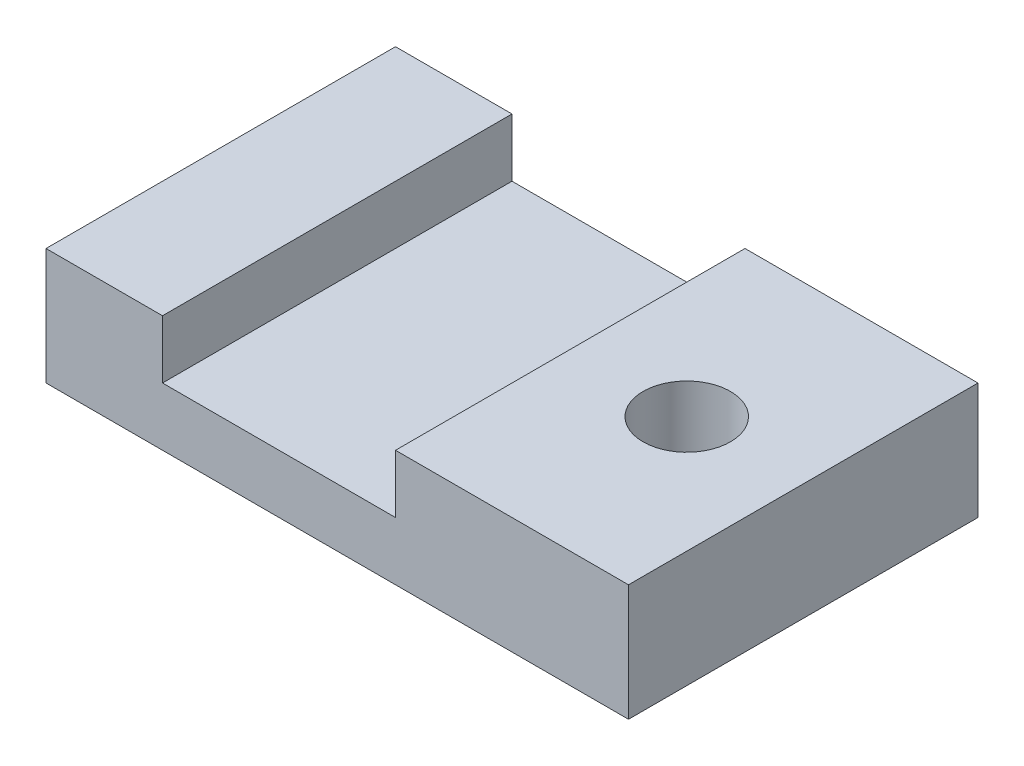
ISO-10303-21;
HEADER;
FILE_DESCRIPTION(('STEP AP214'),'2;1');
FILE_NAME('part.step','',(''),(''),'','','');
FILE_SCHEMA(('AUTOMOTIVE_DESIGN { 1 0 10303 214 1 1 1 1 }'));
ENDSEC;
DATA;
#1=APPLICATION_CONTEXT('core data for automotive mechanical design processes');
#2=APPLICATION_PROTOCOL_DEFINITION('international standard','automotive_design',2000,#1);
#3=PRODUCT_CONTEXT('',#1,'mechanical');
#4=PRODUCT('Part','Part','',(#3));
#5=PRODUCT_RELATED_PRODUCT_CATEGORY('part','',(#4));
#6=PRODUCT_DEFINITION_FORMATION('','',#4);
#7=PRODUCT_DEFINITION_CONTEXT('part definition',#1,'design');
#8=PRODUCT_DEFINITION('design','',#6,#7);
#9=PRODUCT_DEFINITION_SHAPE('','',#8);
#10=(LENGTH_UNIT() NAMED_UNIT(*) SI_UNIT(.MILLI.,.METRE.));
#11=(NAMED_UNIT(*) PLANE_ANGLE_UNIT() SI_UNIT($,.RADIAN.));
#12=(NAMED_UNIT(*) SI_UNIT($,.STERADIAN.) SOLID_ANGLE_UNIT());
#13=UNCERTAINTY_MEASURE_WITH_UNIT(LENGTH_MEASURE(1.E-05),#10,'distance_accuracy_value','');
#14=(GEOMETRIC_REPRESENTATION_CONTEXT(3) GLOBAL_UNCERTAINTY_ASSIGNED_CONTEXT((#13)) GLOBAL_UNIT_ASSIGNED_CONTEXT((#10,
#11,#12)) REPRESENTATION_CONTEXT('',''));
#15=CARTESIAN_POINT('',(0.,0.,0.));
#16=DIRECTION('',(0.,0.,1.));
#17=DIRECTION('',(1.,0.,0.));
#18=AXIS2_PLACEMENT_3D('',#15,#16,#17);
#19=CARTESIAN_POINT('',(0.,0.,-76.2));
#20=DIRECTION('',(-1.,0.,0.));
#21=DIRECTION('',(0.,0.,1.));
#22=AXIS2_PLACEMENT_3D('',#19,#20,#21);
#23=PLANE('',#22);
#24=DIRECTION('',(0.,-1.,0.));
#25=VECTOR('',#24,1.);
#26=CARTESIAN_POINT('',(0.,0.,0.));
#27=LINE('',#26,#25);
#28=CARTESIAN_POINT('',(0.,25.4,0.));
#29=VERTEX_POINT('',#28);
#30=CARTESIAN_POINT('',(0.,0.,0.));
#31=VERTEX_POINT('',#30);
#32=EDGE_CURVE('E130',#29,#31,#27,.T.);
#33=ORIENTED_EDGE('',*,*,#32,.F.);
#34=DIRECTION('',(0.,0.,1.));
#35=VECTOR('',#34,1.);
#36=CARTESIAN_POINT('',(0.,25.4,-76.2));
#37=LINE('',#36,#35);
#38=CARTESIAN_POINT('',(0.,25.4,-76.2));
#39=VERTEX_POINT('',#38);
#40=EDGE_CURVE('E11',#39,#29,#37,.T.);
#41=ORIENTED_EDGE('',*,*,#40,.F.);
#42=DIRECTION('',(0.,-1.,0.));
#43=VECTOR('',#42,1.);
#44=CARTESIAN_POINT('',(0.,0.,-76.2));
#45=LINE('',#44,#43);
#46=CARTESIAN_POINT('',(0.,0.,-76.2));
#47=VERTEX_POINT('',#46);
#48=EDGE_CURVE('E151',#39,#47,#45,.T.);
#49=ORIENTED_EDGE('',*,*,#48,.T.);
#50=DIRECTION('',(0.,0.,1.));
#51=VECTOR('',#50,1.);
#52=CARTESIAN_POINT('',(0.,0.,-76.2));
#53=LINE('',#52,#51);
#54=EDGE_CURVE('E36',#47,#31,#53,.T.);
#55=ORIENTED_EDGE('',*,*,#54,.T.);
#56=EDGE_LOOP('',(#33,#41,#49,#55));
#57=FACE_BOUND('',#56,.T.);
#58=ADVANCED_FACE('F33',(#57),#23,.T.);
#59=CARTESIAN_POINT('',(0.,25.4,-76.2));
#60=DIRECTION('',(0.,1.,0.));
#61=DIRECTION('',(-1.,0.,0.));
#62=AXIS2_PLACEMENT_3D('',#59,#60,#61);
#63=PLANE('',#62);
#64=DIRECTION('',(-1.,0.,0.));
#65=VECTOR('',#64,1.);
#66=CARTESIAN_POINT('',(0.,25.4,0.));
#67=LINE('',#66,#65);
#68=CARTESIAN_POINT('',(25.4,25.4,0.));
#69=VERTEX_POINT('',#68);
#70=EDGE_CURVE('E149',#69,#29,#67,.T.);
#71=ORIENTED_EDGE('',*,*,#70,.F.);
#72=DIRECTION('',(0.,0.,1.));
#73=VECTOR('',#72,1.);
#74=CARTESIAN_POINT('',(25.4,25.4,-76.2));
#75=LINE('',#74,#73);
#76=CARTESIAN_POINT('',(25.4,25.4,-76.2));
#77=VERTEX_POINT('',#76);
#78=EDGE_CURVE('E42',#77,#69,#75,.T.);
#79=ORIENTED_EDGE('',*,*,#78,.F.);
#80=DIRECTION('',(-1.,0.,0.));
#81=VECTOR('',#80,1.);
#82=CARTESIAN_POINT('',(0.,25.4,-76.2));
#83=LINE('',#82,#81);
#84=EDGE_CURVE('E120',#77,#39,#83,.T.);
#85=ORIENTED_EDGE('',*,*,#84,.T.);
#86=ORIENTED_EDGE('',*,*,#40,.T.);
#87=EDGE_LOOP('',(#71,#79,#85,#86));
#88=FACE_BOUND('',#87,.T.);
#89=ADVANCED_FACE('F163',(#88),#63,.T.);
#90=CARTESIAN_POINT('',(25.4,25.4,-76.2));
#91=DIRECTION('',(1.,0.,0.));
#92=DIRECTION('',(0.,0.,-1.));
#93=AXIS2_PLACEMENT_3D('',#90,#91,#92);
#94=PLANE('',#93);
#95=DIRECTION('',(0.,1.,0.));
#96=VECTOR('',#95,1.);
#97=CARTESIAN_POINT('',(25.4,25.4,0.));
#98=LINE('',#97,#96);
#99=CARTESIAN_POINT('',(25.4,12.7,0.));
#100=VERTEX_POINT('',#99);
#101=EDGE_CURVE('E107',#100,#69,#98,.T.);
#102=ORIENTED_EDGE('',*,*,#101,.F.);
#103=DIRECTION('',(0.,0.,1.));
#104=VECTOR('',#103,1.);
#105=CARTESIAN_POINT('',(25.4,12.7,-76.2));
#106=LINE('',#105,#104);
#107=CARTESIAN_POINT('',(25.4,12.7,-76.2));
#108=VERTEX_POINT('',#107);
#109=EDGE_CURVE('E102',#108,#100,#106,.T.);
#110=ORIENTED_EDGE('',*,*,#109,.F.);
#111=DIRECTION('',(0.,1.,0.));
#112=VECTOR('',#111,1.);
#113=CARTESIAN_POINT('',(25.4,25.4,-76.2));
#114=LINE('',#113,#112);
#115=EDGE_CURVE('E105',#108,#77,#114,.T.);
#116=ORIENTED_EDGE('',*,*,#115,.T.);
#117=ORIENTED_EDGE('',*,*,#78,.T.);
#118=EDGE_LOOP('',(#102,#110,#116,#117));
#119=FACE_BOUND('',#118,.T.);
#120=ADVANCED_FACE('F104',(#119),#94,.T.);
#121=CARTESIAN_POINT('',(25.4,12.7,-76.2));
#122=DIRECTION('',(0.,1.,0.));
#123=DIRECTION('',(0.,0.,1.));
#124=AXIS2_PLACEMENT_3D('',#121,#122,#123);
#125=PLANE('',#124);
#126=DIRECTION('',(-1.,0.,0.));
#127=VECTOR('',#126,1.);
#128=CARTESIAN_POINT('',(25.4,12.7,0.));
#129=LINE('',#128,#127);
#130=CARTESIAN_POINT('',(76.2,12.7,0.));
#131=VERTEX_POINT('',#130);
#132=EDGE_CURVE('E146',#131,#100,#129,.T.);
#133=ORIENTED_EDGE('',*,*,#132,.F.);
#134=DIRECTION('',(0.,0.,1.));
#135=VECTOR('',#134,1.);
#136=CARTESIAN_POINT('',(76.2,12.7,-76.2));
#137=LINE('',#136,#135);
#138=CARTESIAN_POINT('',(76.2,12.7,-76.2));
#139=VERTEX_POINT('',#138);
#140=EDGE_CURVE('E112',#139,#131,#137,.T.);
#141=ORIENTED_EDGE('',*,*,#140,.F.);
#142=DIRECTION('',(-1.,0.,0.));
#143=VECTOR('',#142,1.);
#144=CARTESIAN_POINT('',(25.4,12.7,-76.2));
#145=LINE('',#144,#143);
#146=EDGE_CURVE('E118',#139,#108,#145,.T.);
#147=ORIENTED_EDGE('',*,*,#146,.T.);
#148=ORIENTED_EDGE('',*,*,#109,.T.);
#149=EDGE_LOOP('',(#133,#141,#147,#148));
#150=FACE_BOUND('',#149,.T.);
#151=ADVANCED_FACE('F122',(#150),#125,.T.);
#152=CARTESIAN_POINT('',(76.2,12.7,-76.2));
#153=DIRECTION('',(-1.,0.,0.));
#154=DIRECTION('',(0.,-1.,0.));
#155=AXIS2_PLACEMENT_3D('',#152,#153,#154);
#156=PLANE('',#155);
#157=DIRECTION('',(0.,-1.,0.));
#158=VECTOR('',#157,1.);
#159=CARTESIAN_POINT('',(76.2,12.7,0.));
#160=LINE('',#159,#158);
#161=CARTESIAN_POINT('',(76.2,25.4,0.));
#162=VERTEX_POINT('',#161);
#163=EDGE_CURVE('E143',#162,#131,#160,.T.);
#164=ORIENTED_EDGE('',*,*,#163,.F.);
#165=DIRECTION('',(0.,0.,1.));
#166=VECTOR('',#165,1.);
#167=CARTESIAN_POINT('',(76.2,25.4,-76.2));
#168=LINE('',#167,#166);
#169=CARTESIAN_POINT('',(76.2,25.4,-76.2));
#170=VERTEX_POINT('',#169);
#171=EDGE_CURVE('E155',#170,#162,#168,.T.);
#172=ORIENTED_EDGE('',*,*,#171,.F.);
#173=DIRECTION('',(0.,-1.,0.));
#174=VECTOR('',#173,1.);
#175=CARTESIAN_POINT('',(76.2,12.7,-76.2));
#176=LINE('',#175,#174);
#177=EDGE_CURVE('E123',#170,#139,#176,.T.);
#178=ORIENTED_EDGE('',*,*,#177,.T.);
#179=ORIENTED_EDGE('',*,*,#140,.T.);
#180=EDGE_LOOP('',(#164,#172,#178,#179));
#181=FACE_BOUND('',#180,.T.);
#182=ADVANCED_FACE('F176',(#181),#156,.T.);
#183=CARTESIAN_POINT('',(76.2,25.4,-76.2));
#184=DIRECTION('',(0.,1.,0.));
#185=DIRECTION('',(0.,0.,1.));
#186=AXIS2_PLACEMENT_3D('',#183,#184,#185);
#187=PLANE('',#186);
#188=CARTESIAN_POINT('',(101.6,25.4,-38.1));
#189=DIRECTION('',(0.,1.,0.));
#190=DIRECTION('',(0.,0.,1.));
#191=AXIS2_PLACEMENT_3D('',#188,#189,#190);
#192=CIRCLE('',#191,9.52500000000001);
#193=CARTESIAN_POINT('',(101.6,25.4,-28.575));
#194=VERTEX_POINT('',#193);
#195=EDGE_CURVE('E195',#194,#194,#192,.T.);
#196=ORIENTED_EDGE('',*,*,#195,.F.);
#197=EDGE_LOOP('',(#196));
#198=FACE_BOUND('',#197,.T.);
#199=DIRECTION('',(-1.,0.,0.));
#200=VECTOR('',#199,1.);
#201=CARTESIAN_POINT('',(76.2,25.4,0.));
#202=LINE('',#201,#200);
#203=CARTESIAN_POINT('',(127.,25.4,0.));
#204=VERTEX_POINT('',#203);
#205=EDGE_CURVE('E140',#204,#162,#202,.T.);
#206=ORIENTED_EDGE('',*,*,#205,.F.);
#207=DIRECTION('',(0.,0.,1.));
#208=VECTOR('',#207,1.);
#209=CARTESIAN_POINT('',(127.,25.4,-76.2));
#210=LINE('',#209,#208);
#211=CARTESIAN_POINT('',(127.,25.4,-76.2));
#212=VERTEX_POINT('',#211);
#213=EDGE_CURVE('E157',#212,#204,#210,.T.);
#214=ORIENTED_EDGE('',*,*,#213,.F.);
#215=DIRECTION('',(-1.,0.,0.));
#216=VECTOR('',#215,1.);
#217=CARTESIAN_POINT('',(76.2,25.4,-76.2));
#218=LINE('',#217,#216);
#219=EDGE_CURVE('E125',#212,#170,#218,.T.);
#220=ORIENTED_EDGE('',*,*,#219,.T.);
#221=ORIENTED_EDGE('',*,*,#171,.T.);
#222=EDGE_LOOP('',(#206,#214,#220,#221));
#223=FACE_BOUND('',#222,.T.);
#224=ADVANCED_FACE('F179',(#198,#223),#187,.T.);
#225=CARTESIAN_POINT('',(127.,0.,-76.2));
#226=DIRECTION('',(1.,0.,0.));
#227=DIRECTION('',(0.,0.,-1.));
#228=AXIS2_PLACEMENT_3D('',#225,#226,#227);
#229=PLANE('',#228);
#230=DIRECTION('',(0.,1.,0.));
#231=VECTOR('',#230,1.);
#232=CARTESIAN_POINT('',(127.,0.,0.));
#233=LINE('',#232,#231);
#234=CARTESIAN_POINT('',(127.,0.,0.));
#235=VERTEX_POINT('',#234);
#236=EDGE_CURVE('E137',#235,#204,#233,.T.);
#237=ORIENTED_EDGE('',*,*,#236,.F.);
#238=DIRECTION('',(0.,0.,1.));
#239=VECTOR('',#238,1.);
#240=CARTESIAN_POINT('',(127.,0.,-76.2));
#241=LINE('',#240,#239);
#242=CARTESIAN_POINT('',(127.,0.,-76.2));
#243=VERTEX_POINT('',#242);
#244=EDGE_CURVE('E158',#243,#235,#241,.T.);
#245=ORIENTED_EDGE('',*,*,#244,.F.);
#246=DIRECTION('',(0.,1.,0.));
#247=VECTOR('',#246,1.);
#248=CARTESIAN_POINT('',(127.,0.,-76.2));
#249=LINE('',#248,#247);
#250=EDGE_CURVE('E203',#243,#212,#249,.T.);
#251=ORIENTED_EDGE('',*,*,#250,.T.);
#252=ORIENTED_EDGE('',*,*,#213,.T.);
#253=EDGE_LOOP('',(#237,#245,#251,#252));
#254=FACE_BOUND('',#253,.T.);
#255=ADVANCED_FACE('F183',(#254),#229,.T.);
#256=CARTESIAN_POINT('',(0.,0.,-76.2));
#257=DIRECTION('',(0.,-1.,0.));
#258=DIRECTION('',(0.,0.,-1.));
#259=AXIS2_PLACEMENT_3D('',#256,#257,#258);
#260=PLANE('',#259);
#261=CARTESIAN_POINT('',(101.6,0.,-38.1));
#262=DIRECTION('',(0.,1.,0.));
#263=DIRECTION('',(0.,0.,1.));
#264=AXIS2_PLACEMENT_3D('',#261,#262,#263);
#265=CIRCLE('',#264,9.52500000000001);
#266=CARTESIAN_POINT('',(101.6,0.,-28.575));
#267=VERTEX_POINT('',#266);
#268=EDGE_CURVE('E134',#267,#267,#265,.T.);
#269=ORIENTED_EDGE('',*,*,#268,.T.);
#270=EDGE_LOOP('',(#269));
#271=FACE_BOUND('',#270,.T.);
#272=DIRECTION('',(1.,0.,0.));
#273=VECTOR('',#272,1.);
#274=CARTESIAN_POINT('',(0.,0.,0.));
#275=LINE('',#274,#273);
#276=EDGE_CURVE('E133',#31,#235,#275,.T.);
#277=ORIENTED_EDGE('',*,*,#276,.F.);
#278=ORIENTED_EDGE('',*,*,#54,.F.);
#279=DIRECTION('',(1.,0.,0.));
#280=VECTOR('',#279,1.);
#281=CARTESIAN_POINT('',(0.,0.,-76.2));
#282=LINE('',#281,#280);
#283=EDGE_CURVE('E201',#47,#243,#282,.T.);
#284=ORIENTED_EDGE('',*,*,#283,.T.);
#285=ORIENTED_EDGE('',*,*,#244,.T.);
#286=EDGE_LOOP('',(#277,#278,#284,#285));
#287=FACE_BOUND('',#286,.T.);
#288=ADVANCED_FACE('F160',(#271,#287),#260,.T.);
#289=CARTESIAN_POINT('',(0.,0.,-76.2));
#290=DIRECTION('',(0.,0.,-1.));
#291=DIRECTION('',(-1.,0.,0.));
#292=AXIS2_PLACEMENT_3D('',#289,#290,#291);
#293=PLANE('',#292);
#294=ORIENTED_EDGE('',*,*,#48,.F.);
#295=ORIENTED_EDGE('',*,*,#84,.F.);
#296=ORIENTED_EDGE('',*,*,#115,.F.);
#297=ORIENTED_EDGE('',*,*,#146,.F.);
#298=ORIENTED_EDGE('',*,*,#177,.F.);
#299=ORIENTED_EDGE('',*,*,#219,.F.);
#300=ORIENTED_EDGE('',*,*,#250,.F.);
#301=ORIENTED_EDGE('',*,*,#283,.F.);
#302=EDGE_LOOP('',(#294,#295,#296,#297,#298,#299,#300,#301));
#303=FACE_BOUND('',#302,.T.);
#304=ADVANCED_FACE('F116',(#303),#293,.T.);
#305=CARTESIAN_POINT('',(0.,0.,0.));
#306=DIRECTION('',(0.,0.,-1.));
#307=DIRECTION('',(-1.,0.,0.));
#308=AXIS2_PLACEMENT_3D('',#305,#306,#307);
#309=PLANE('',#308);
#310=ORIENTED_EDGE('',*,*,#32,.T.);
#311=ORIENTED_EDGE('',*,*,#276,.T.);
#312=ORIENTED_EDGE('',*,*,#236,.T.);
#313=ORIENTED_EDGE('',*,*,#205,.T.);
#314=ORIENTED_EDGE('',*,*,#163,.T.);
#315=ORIENTED_EDGE('',*,*,#132,.T.);
#316=ORIENTED_EDGE('',*,*,#101,.T.);
#317=ORIENTED_EDGE('',*,*,#70,.T.);
#318=EDGE_LOOP('',(#310,#311,#312,#313,#314,#315,#316,#317));
#319=FACE_BOUND('',#318,.T.);
#320=ADVANCED_FACE('F162',(#319),#309,.F.);
#321=CARTESIAN_POINT('',(101.6,0.,-38.1));
#322=DIRECTION('',(0.,1.,0.));
#323=DIRECTION('',(0.,0.,1.));
#324=AXIS2_PLACEMENT_3D('',#321,#322,#323);
#325=CYLINDRICAL_SURFACE('',#324,9.52500000000001);
#326=ORIENTED_EDGE('',*,*,#268,.F.);
#327=EDGE_LOOP('',(#326));
#328=FACE_BOUND('',#327,.T.);
#329=ORIENTED_EDGE('',*,*,#195,.T.);
#330=EDGE_LOOP('',(#329));
#331=FACE_BOUND('',#330,.T.);
#332=ADVANCED_FACE('F213',(#328,#331),#325,.F.);
#333=CLOSED_SHELL('',(#58,#89,#120,#151,#182,#224,#255,#288,#304,#320,#332));
#334=MANIFOLD_SOLID_BREP('B2',#333);
#335=ADVANCED_BREP_SHAPE_REPRESENTATION('',(#18,#334),#14);
#336=SHAPE_DEFINITION_REPRESENTATION(#9,#335);
ENDSEC;
END-ISO-10303-21;
